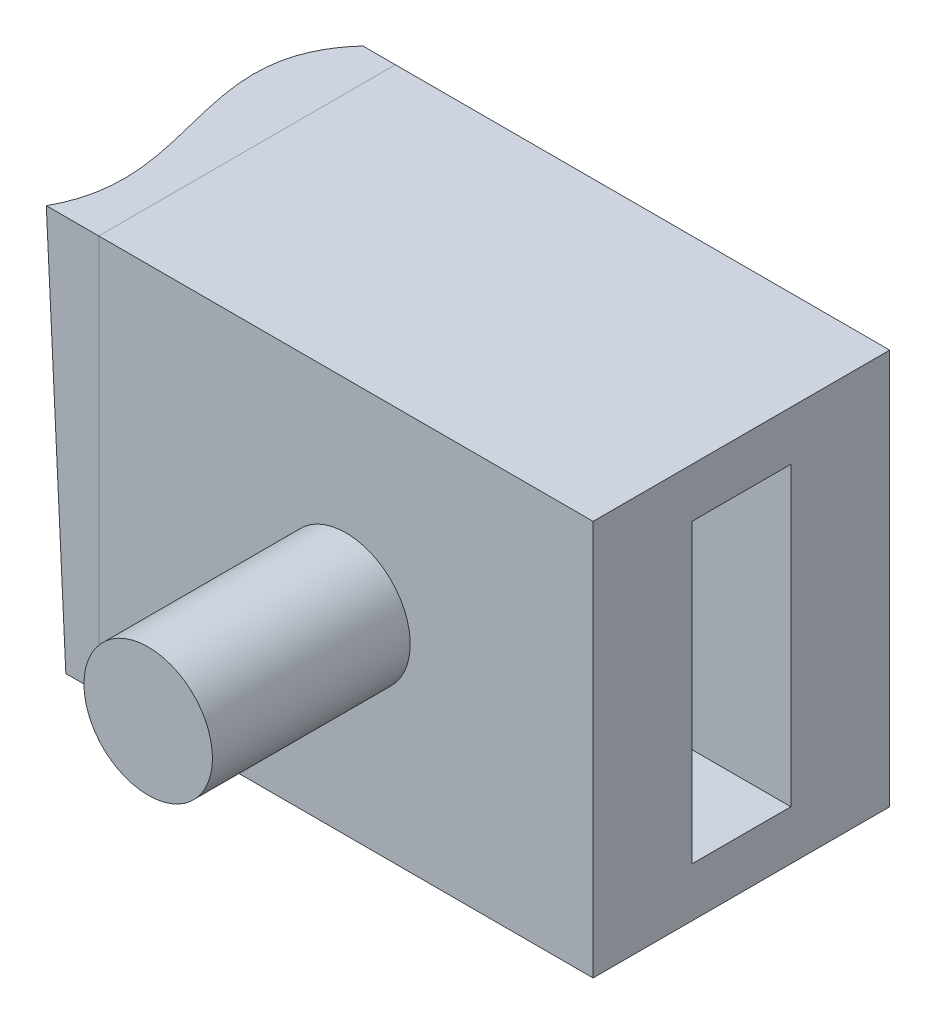
ISO-10303-21;
HEADER;
FILE_DESCRIPTION(('STEP AP214'),'2;1');
FILE_NAME('part.step','',(''),(''),'','','');
FILE_SCHEMA(('AUTOMOTIVE_DESIGN { 1 0 10303 214 1 1 1 1 }'));
ENDSEC;
DATA;
#1=APPLICATION_CONTEXT('core data for automotive mechanical design processes');
#2=APPLICATION_PROTOCOL_DEFINITION('international standard','automotive_design',2000,#1);
#3=PRODUCT_CONTEXT('',#1,'mechanical');
#4=PRODUCT('Part','Part','',(#3));
#5=PRODUCT_RELATED_PRODUCT_CATEGORY('part','',(#4));
#6=PRODUCT_DEFINITION_FORMATION('','',#4);
#7=PRODUCT_DEFINITION_CONTEXT('part definition',#1,'design');
#8=PRODUCT_DEFINITION('design','',#6,#7);
#9=PRODUCT_DEFINITION_SHAPE('','',#8);
#10=(LENGTH_UNIT() NAMED_UNIT(*) SI_UNIT(.MILLI.,.METRE.));
#11=(NAMED_UNIT(*) PLANE_ANGLE_UNIT() SI_UNIT($,.RADIAN.));
#12=(NAMED_UNIT(*) SI_UNIT($,.STERADIAN.) SOLID_ANGLE_UNIT());
#13=UNCERTAINTY_MEASURE_WITH_UNIT(LENGTH_MEASURE(1.E-05),#10,'distance_accuracy_value','');
#14=(GEOMETRIC_REPRESENTATION_CONTEXT(3) GLOBAL_UNCERTAINTY_ASSIGNED_CONTEXT((#13)) GLOBAL_UNIT_ASSIGNED_CONTEXT((#10,
#11,#12)) REPRESENTATION_CONTEXT('',''));
#15=CARTESIAN_POINT('',(0.,0.,0.));
#16=DIRECTION('',(0.,0.,1.));
#17=DIRECTION('',(1.,0.,0.));
#18=AXIS2_PLACEMENT_3D('',#15,#16,#17);
#19=CARTESIAN_POINT('',(12.5,0.,17.5));
#20=DIRECTION('',(0.,0.,1.));
#21=DIRECTION('',(1.,0.,0.));
#22=AXIS2_PLACEMENT_3D('',#19,#20,#21);
#23=PLANE('',#22);
#24=CARTESIAN_POINT('',(12.5,0.,17.5));
#25=DIRECTION('',(0.,0.,1.));
#26=DIRECTION('',(1.,0.,0.));
#27=AXIS2_PLACEMENT_3D('',#24,#25,#26);
#28=CIRCLE('',#27,3.25);
#29=CARTESIAN_POINT('',(15.75,0.,17.5));
#30=VERTEX_POINT('',#29);
#31=EDGE_CURVE('E324',#30,#30,#28,.T.);
#32=ORIENTED_EDGE('',*,*,#31,.T.);
#33=EDGE_LOOP('',(#32));
#34=FACE_BOUND('',#33,.T.);
#35=ADVANCED_FACE('F43',(#34),#23,.T.);
#36=CARTESIAN_POINT('',(12.5,0.,17.5));
#37=DIRECTION('',(0.,0.,-1.));
#38=DIRECTION('',(-1.,0.,0.));
#39=AXIS2_PLACEMENT_3D('',#36,#37,#38);
#40=CYLINDRICAL_SURFACE('',#39,3.25);
#41=ORIENTED_EDGE('',*,*,#31,.F.);
#42=EDGE_LOOP('',(#41));
#43=FACE_BOUND('',#42,.T.);
#44=CARTESIAN_POINT('',(12.5,0.,7.5));
#45=DIRECTION('',(0.,0.,-1.));
#46=DIRECTION('',(-1.,0.,0.));
#47=AXIS2_PLACEMENT_3D('',#44,#45,#46);
#48=CIRCLE('',#47,3.25);
#49=CARTESIAN_POINT('',(9.25,0.,7.5));
#50=VERTEX_POINT('',#49);
#51=EDGE_CURVE('E47',#50,#50,#48,.F.);
#52=ORIENTED_EDGE('',*,*,#51,.T.);
#53=EDGE_LOOP('',(#52));
#54=FACE_BOUND('',#53,.T.);
#55=ADVANCED_FACE('F377',(#43,#54),#40,.T.);
#56=CARTESIAN_POINT('',(25.,-7.5,2.5));
#57=DIRECTION('',(0.,1.,0.));
#58=DIRECTION('',(0.,0.,1.));
#59=AXIS2_PLACEMENT_3D('',#56,#57,#58);
#60=PLANE('',#59);
#61=DIRECTION('',(0.,0.,1.));
#62=VECTOR('',#61,1.);
#63=CARTESIAN_POINT('',(0.,-7.5,-2.5));
#64=LINE('',#63,#62);
#65=CARTESIAN_POINT('',(0.,-7.5,-2.5));
#66=VERTEX_POINT('',#65);
#67=CARTESIAN_POINT('',(0.,-7.5,2.5));
#68=VERTEX_POINT('',#67);
#69=EDGE_CURVE('E141',#66,#68,#64,.T.);
#70=ORIENTED_EDGE('',*,*,#69,.T.);
#71=DIRECTION('',(-1.,0.,0.));
#72=VECTOR('',#71,1.);
#73=CARTESIAN_POINT('',(25.,-7.5,2.5));
#74=LINE('',#73,#72);
#75=CARTESIAN_POINT('',(25.,-7.5,2.5));
#76=VERTEX_POINT('',#75);
#77=EDGE_CURVE('E133',#76,#68,#74,.T.);
#78=ORIENTED_EDGE('',*,*,#77,.F.);
#79=DIRECTION('',(0.,0.,-1.));
#80=VECTOR('',#79,1.);
#81=CARTESIAN_POINT('',(25.,-7.5,2.5));
#82=LINE('',#81,#80);
#83=CARTESIAN_POINT('',(25.,-7.5,-2.5));
#84=VERTEX_POINT('',#83);
#85=EDGE_CURVE('E138',#76,#84,#82,.T.);
#86=ORIENTED_EDGE('',*,*,#85,.T.);
#87=DIRECTION('',(-1.,0.,0.));
#88=VECTOR('',#87,1.);
#89=CARTESIAN_POINT('',(25.,-7.5,-2.5));
#90=LINE('',#89,#88);
#91=EDGE_CURVE('E145',#84,#66,#90,.T.);
#92=ORIENTED_EDGE('',*,*,#91,.T.);
#93=EDGE_LOOP('',(#70,#78,#86,#92));
#94=FACE_BOUND('',#93,.T.);
#95=ADVANCED_FACE('F135',(#94),#60,.T.);
#96=CARTESIAN_POINT('',(25.,7.5,2.5));
#97=DIRECTION('',(0.,0.,-1.));
#98=DIRECTION('',(-1.,0.,0.));
#99=AXIS2_PLACEMENT_3D('',#96,#97,#98);
#100=PLANE('',#99);
#101=DIRECTION('',(0.,1.,0.));
#102=VECTOR('',#101,1.);
#103=CARTESIAN_POINT('',(0.,-7.5,2.5));
#104=LINE('',#103,#102);
#105=CARTESIAN_POINT('',(0.,7.5,2.5));
#106=VERTEX_POINT('',#105);
#107=EDGE_CURVE('E322',#68,#106,#104,.T.);
#108=ORIENTED_EDGE('',*,*,#107,.T.);
#109=DIRECTION('',(-1.,0.,0.));
#110=VECTOR('',#109,1.);
#111=CARTESIAN_POINT('',(25.,7.5,2.5));
#112=LINE('',#111,#110);
#113=CARTESIAN_POINT('',(25.,7.5,2.5));
#114=VERTEX_POINT('',#113);
#115=EDGE_CURVE('E144',#114,#106,#112,.T.);
#116=ORIENTED_EDGE('',*,*,#115,.F.);
#117=DIRECTION('',(0.,-1.,0.));
#118=VECTOR('',#117,1.);
#119=CARTESIAN_POINT('',(25.,7.5,2.5));
#120=LINE('',#119,#118);
#121=EDGE_CURVE('E149',#114,#76,#120,.T.);
#122=ORIENTED_EDGE('',*,*,#121,.T.);
#123=ORIENTED_EDGE('',*,*,#77,.T.);
#124=EDGE_LOOP('',(#108,#116,#122,#123));
#125=FACE_BOUND('',#124,.T.);
#126=ADVANCED_FACE('F150',(#125),#100,.T.);
#127=CARTESIAN_POINT('',(25.,7.5,2.5));
#128=DIRECTION('',(0.,-1.,0.));
#129=DIRECTION('',(0.,0.,-1.));
#130=AXIS2_PLACEMENT_3D('',#127,#128,#129);
#131=PLANE('',#130);
#132=DIRECTION('',(0.,0.,-1.));
#133=VECTOR('',#132,1.);
#134=CARTESIAN_POINT('',(0.,7.5,2.5));
#135=LINE('',#134,#133);
#136=CARTESIAN_POINT('',(0.,7.5,-2.5));
#137=VERTEX_POINT('',#136);
#138=EDGE_CURVE('E332',#106,#137,#135,.T.);
#139=ORIENTED_EDGE('',*,*,#138,.T.);
#140=DIRECTION('',(-1.,0.,0.));
#141=VECTOR('',#140,1.);
#142=CARTESIAN_POINT('',(25.,7.5,-2.5));
#143=LINE('',#142,#141);
#144=CARTESIAN_POINT('',(25.,7.5,-2.5));
#145=VERTEX_POINT('',#144);
#146=EDGE_CURVE('E164',#145,#137,#143,.T.);
#147=ORIENTED_EDGE('',*,*,#146,.F.);
#148=DIRECTION('',(0.,0.,1.));
#149=VECTOR('',#148,1.);
#150=CARTESIAN_POINT('',(25.,7.5,2.5));
#151=LINE('',#150,#149);
#152=EDGE_CURVE('E154',#145,#114,#151,.T.);
#153=ORIENTED_EDGE('',*,*,#152,.T.);
#154=ORIENTED_EDGE('',*,*,#115,.T.);
#155=EDGE_LOOP('',(#139,#147,#153,#154));
#156=FACE_BOUND('',#155,.T.);
#157=ADVANCED_FACE('F329',(#156),#131,.T.);
#158=CARTESIAN_POINT('',(25.,7.5,-2.5));
#159=DIRECTION('',(0.,0.,1.));
#160=DIRECTION('',(1.,0.,0.));
#161=AXIS2_PLACEMENT_3D('',#158,#159,#160);
#162=PLANE('',#161);
#163=DIRECTION('',(0.,-1.,0.));
#164=VECTOR('',#163,1.);
#165=CARTESIAN_POINT('',(0.,7.5,-2.5));
#166=LINE('',#165,#164);
#167=EDGE_CURVE('E337',#137,#66,#166,.T.);
#168=ORIENTED_EDGE('',*,*,#167,.T.);
#169=ORIENTED_EDGE('',*,*,#91,.F.);
#170=DIRECTION('',(0.,1.,0.));
#171=VECTOR('',#170,1.);
#172=CARTESIAN_POINT('',(25.,7.5,-2.5));
#173=LINE('',#172,#171);
#174=EDGE_CURVE('E158',#84,#145,#173,.T.);
#175=ORIENTED_EDGE('',*,*,#174,.T.);
#176=ORIENTED_EDGE('',*,*,#146,.T.);
#177=EDGE_LOOP('',(#168,#169,#175,#176));
#178=FACE_BOUND('',#177,.T.);
#179=ADVANCED_FACE('F335',(#178),#162,.T.);
#180=CARTESIAN_POINT('',(25.,-10.,7.5));
#181=DIRECTION('',(0.,1.,0.));
#182=DIRECTION('',(0.,0.,1.));
#183=AXIS2_PLACEMENT_3D('',#180,#181,#182);
#184=PLANE('',#183);
#185=DIRECTION('',(0.,0.,1.));
#186=VECTOR('',#185,1.);
#187=CARTESIAN_POINT('',(0.,-10.,-7.5));
#188=LINE('',#187,#186);
#189=CARTESIAN_POINT('',(0.,-10.,-7.5));
#190=VERTEX_POINT('',#189);
#191=CARTESIAN_POINT('',(0.,-10.,7.5));
#192=VERTEX_POINT('',#191);
#193=EDGE_CURVE('E261',#190,#192,#188,.T.);
#194=ORIENTED_EDGE('',*,*,#193,.F.);
#195=DIRECTION('',(-1.,0.,0.));
#196=VECTOR('',#195,1.);
#197=CARTESIAN_POINT('',(25.,-10.,-7.5));
#198=LINE('',#197,#196);
#199=CARTESIAN_POINT('',(25.,-10.,-7.5));
#200=VERTEX_POINT('',#199);
#201=EDGE_CURVE('E174',#200,#190,#198,.T.);
#202=ORIENTED_EDGE('',*,*,#201,.F.);
#203=DIRECTION('',(0.,0.,-1.));
#204=VECTOR('',#203,1.);
#205=CARTESIAN_POINT('',(25.,-10.,7.5));
#206=LINE('',#205,#204);
#207=CARTESIAN_POINT('',(25.,-10.,7.5));
#208=VERTEX_POINT('',#207);
#209=EDGE_CURVE('E128',#208,#200,#206,.T.);
#210=ORIENTED_EDGE('',*,*,#209,.F.);
#211=DIRECTION('',(-1.,0.,0.));
#212=VECTOR('',#211,1.);
#213=CARTESIAN_POINT('',(25.,-10.,7.5));
#214=LINE('',#213,#212);
#215=EDGE_CURVE('E176',#208,#192,#214,.T.);
#216=ORIENTED_EDGE('',*,*,#215,.T.);
#217=EDGE_LOOP('',(#194,#202,#210,#216));
#218=FACE_BOUND('',#217,.T.);
#219=ADVANCED_FACE('F390',(#218),#184,.F.);
#220=CARTESIAN_POINT('',(25.,10.,7.5));
#221=DIRECTION('',(0.,-1.,0.));
#222=DIRECTION('',(0.,0.,-1.));
#223=AXIS2_PLACEMENT_3D('',#220,#221,#222);
#224=PLANE('',#223);
#225=DIRECTION('',(0.,0.,-1.));
#226=VECTOR('',#225,1.);
#227=CARTESIAN_POINT('',(0.,10.,7.5));
#228=LINE('',#227,#226);
#229=CARTESIAN_POINT('',(0.,10.,7.5));
#230=VERTEX_POINT('',#229);
#231=CARTESIAN_POINT('',(0.,10.,-7.5));
#232=VERTEX_POINT('',#231);
#233=EDGE_CURVE('E11',#230,#232,#228,.T.);
#234=ORIENTED_EDGE('',*,*,#233,.F.);
#235=DIRECTION('',(-1.,0.,0.));
#236=VECTOR('',#235,1.);
#237=CARTESIAN_POINT('',(25.,10.,7.5));
#238=LINE('',#237,#236);
#239=CARTESIAN_POINT('',(25.,10.,7.5));
#240=VERTEX_POINT('',#239);
#241=EDGE_CURVE('E179',#240,#230,#238,.T.);
#242=ORIENTED_EDGE('',*,*,#241,.F.);
#243=DIRECTION('',(0.,0.,1.));
#244=VECTOR('',#243,1.);
#245=CARTESIAN_POINT('',(25.,10.,7.5));
#246=LINE('',#245,#244);
#247=CARTESIAN_POINT('',(25.,10.,-7.5));
#248=VERTEX_POINT('',#247);
#249=EDGE_CURVE('E169',#248,#240,#246,.T.);
#250=ORIENTED_EDGE('',*,*,#249,.F.);
#251=DIRECTION('',(-1.,0.,0.));
#252=VECTOR('',#251,1.);
#253=CARTESIAN_POINT('',(25.,10.,-7.5));
#254=LINE('',#253,#252);
#255=EDGE_CURVE('E181',#248,#232,#254,.T.);
#256=ORIENTED_EDGE('',*,*,#255,.T.);
#257=EDGE_LOOP('',(#234,#242,#250,#256));
#258=FACE_BOUND('',#257,.T.);
#259=ADVANCED_FACE('F395',(#258),#224,.F.);
#260=CARTESIAN_POINT('',(25.,10.,-7.5));
#261=DIRECTION('',(0.,0.,1.));
#262=DIRECTION('',(1.,0.,0.));
#263=AXIS2_PLACEMENT_3D('',#260,#261,#262);
#264=PLANE('',#263);
#265=DIRECTION('',(0.,-1.,0.));
#266=VECTOR('',#265,1.);
#267=CARTESIAN_POINT('',(0.,10.,-7.5));
#268=LINE('',#267,#266);
#269=EDGE_CURVE('E63',#232,#190,#268,.T.);
#270=ORIENTED_EDGE('',*,*,#269,.F.);
#271=ORIENTED_EDGE('',*,*,#255,.F.);
#272=DIRECTION('',(0.,1.,0.));
#273=VECTOR('',#272,1.);
#274=CARTESIAN_POINT('',(25.,10.,-7.5));
#275=LINE('',#274,#273);
#276=EDGE_CURVE('E167',#200,#248,#275,.T.);
#277=ORIENTED_EDGE('',*,*,#276,.F.);
#278=ORIENTED_EDGE('',*,*,#201,.T.);
#279=EDGE_LOOP('',(#270,#271,#277,#278));
#280=FACE_BOUND('',#279,.T.);
#281=ADVANCED_FACE('F45',(#280),#264,.F.);
#282=CARTESIAN_POINT('',(25.,0.,0.));
#283=DIRECTION('',(1.,0.,0.));
#284=DIRECTION('',(0.,0.,-1.));
#285=AXIS2_PLACEMENT_3D('',#282,#283,#284);
#286=PLANE('',#285);
#287=ORIENTED_EDGE('',*,*,#276,.T.);
#288=ORIENTED_EDGE('',*,*,#249,.T.);
#289=DIRECTION('',(0.,-1.,0.));
#290=VECTOR('',#289,1.);
#291=CARTESIAN_POINT('',(25.,10.,7.5));
#292=LINE('',#291,#290);
#293=EDGE_CURVE('E171',#240,#208,#292,.T.);
#294=ORIENTED_EDGE('',*,*,#293,.T.);
#295=ORIENTED_EDGE('',*,*,#209,.T.);
#296=EDGE_LOOP('',(#287,#288,#294,#295));
#297=FACE_BOUND('',#296,.T.);
#298=ORIENTED_EDGE('',*,*,#152,.F.);
#299=ORIENTED_EDGE('',*,*,#174,.F.);
#300=ORIENTED_EDGE('',*,*,#85,.F.);
#301=ORIENTED_EDGE('',*,*,#121,.F.);
#302=EDGE_LOOP('',(#298,#299,#300,#301));
#303=FACE_BOUND('',#302,.T.);
#304=ADVANCED_FACE('F157',(#297,#303),#286,.T.);
#305=CARTESIAN_POINT('',(25.,10.,7.5));
#306=DIRECTION('',(0.,0.,-1.));
#307=DIRECTION('',(-1.,0.,0.));
#308=AXIS2_PLACEMENT_3D('',#305,#306,#307);
#309=PLANE('',#308);
#310=DIRECTION('',(0.,1.,0.));
#311=VECTOR('',#310,1.);
#312=CARTESIAN_POINT('',(0.,-10.,7.5));
#313=LINE('',#312,#311);
#314=EDGE_CURVE('E312',#192,#230,#313,.T.);
#315=ORIENTED_EDGE('',*,*,#314,.F.);
#316=ORIENTED_EDGE('',*,*,#215,.F.);
#317=ORIENTED_EDGE('',*,*,#293,.F.);
#318=ORIENTED_EDGE('',*,*,#241,.T.);
#319=EDGE_LOOP('',(#315,#316,#317,#318));
#320=FACE_BOUND('',#319,.T.);
#321=ORIENTED_EDGE('',*,*,#51,.F.);
#322=EDGE_LOOP('',(#321));
#323=FACE_BOUND('',#322,.T.);
#324=ADVANCED_FACE('F219',(#320,#323),#309,.F.);
#325=CARTESIAN_POINT('',(3.71805831252915,13.079715564425,-10.2531807446201));
#326=CARTESIAN_POINT('',(-6.04701305923015,-13.0797172798257,-10.613541833322));
#327=CARTESIAN_POINT('',(-2.77246559441149,13.079715564425,-8.0014481940857));
#328=CARTESIAN_POINT('',(-0.96262990089649,-13.0797172798257,-7.8917788356021));
#329=CARTESIAN_POINT('',(-4.88527352275378,13.079715564425,-1.33938259411544));
#330=CARTESIAN_POINT('',(-3.86404941263161,-13.0797172798257,-0.734794599162323));
#331=CARTESIAN_POINT('',(0.673781907109332,13.0797155644249,6.29134710421849));
#332=CARTESIAN_POINT('',(-0.111870438855858,-13.0797172798256,6.10317211042511));
#333=CARTESIAN_POINT('',(-5.96230706943497,13.079715564425,10.4735000024621));
#334=CARTESIAN_POINT('',(-2.51721163450627,-13.0797172798257,10.5545776532944));
#335=B_SPLINE_SURFACE_WITH_KNOTS('',3,1,((#325,#326),(#327,#328),(#329,#330),(#331,#332),(#333,
#334)),.UNSPECIFIED.,.F.,.F.,.F.,(4,1,4),(2,2),(-0.211521540195221,0.336660749383848,
1.19995337271277),(-0.153985778221248,1.15398586399128),.UNSPECIFIED.);
#336=CARTESIAN_POINT('',(-3.02294094052801,7.499999998,-2.5));
#337=CARTESIAN_POINT('',(-2.90743784606255,4.46176789050985,-2.5));
#338=CARTESIAN_POINT('',(-2.78972095341892,1.42362288899021,-2.5));
#339=CARTESIAN_POINT('',(-2.5923424358101,-3.57632632938115,-2.5));
#340=CARTESIAN_POINT('',(-2.51397140895736,-5.53818132719484,-2.5));
#341=CARTESIAN_POINT('',(-2.43467718203889,-7.5,-2.5));
#342=B_SPLINE_CURVE_WITH_KNOTS('',3,(#336,#337,#338,#339,#340,#341),.UNSPECIFIED.,.F.,.F.,(4,2,
4),(0.,9.12127408061243,15.0115332814175),.UNSPECIFIED.);
#343=CARTESIAN_POINT('',(-3.02294094056566,7.499999999,-2.4999999999963));
#344=VERTEX_POINT('',#343);
#345=CARTESIAN_POINT('',(-2.43467718203889,-7.5,-2.5));
#346=VERTEX_POINT('',#345);
#347=EDGE_CURVE('E186',#344,#346,#342,.T.);
#348=CARTESIAN_POINT('',(-2.01556673417182,7.5,2.49999999846474));
#349=CARTESIAN_POINT('',(-2.05230035302554,7.5,2.29047338988391));
#350=CARTESIAN_POINT('',(-2.09284809192719,7.5,2.08168809548985));
#351=CARTESIAN_POINT('',(-2.17916728765718,7.5,1.66530011040875));
#352=CARTESIAN_POINT('',(-2.22493608722889,7.5,1.45769687410312));
#353=CARTESIAN_POINT('',(-2.31933124886649,7.5,1.04317766249757));
#354=CARTESIAN_POINT('',(-2.36795738739771,7.5,0.836261634770593));
#355=CARTESIAN_POINT('',(-2.46579715598391,7.5,0.422594229911286));
#356=CARTESIAN_POINT('',(-2.51501071726817,7.5,0.215842836470098));
#357=CARTESIAN_POINT('',(-2.61178107212261,7.5,-0.198225064236752));
#358=CARTESIAN_POINT('',(-2.65933654163239,7.5,-0.405541886760893));
#359=CARTESIAN_POINT('',(-2.75032763324649,7.5,-0.820983372087367));
#360=CARTESIAN_POINT('',(-2.79376525823959,7.5,-1.02910759036761));
#361=CARTESIAN_POINT('',(-2.87397285628504,7.5,-1.44667362325109));
#362=CARTESIAN_POINT('',(-2.91074317664168,7.5,-1.65611536863508));
#363=CARTESIAN_POINT('',(-2.97475649540934,7.5,-2.07677853778099));
#364=CARTESIAN_POINT('',(-3.00198379047713,7.5,-2.2880023145938));
#365=CARTESIAN_POINT('',(-3.02294094060331,7.5,-2.49999999999258));
#366=B_SPLINE_CURVE_WITH_KNOTS('',3,(#348,#349,#350,#351,#352,#353,#354,#355,#356,#357,#358,
#359,#360,#361,#362,#363,#364,#365),.UNSPECIFIED.,.F.,.F.,(4,2,2,2,2,2,2,2,4),(0.,
0.638031665467256,1.27574004170358,1.91339859513445,2.55098321490764,3.18906582741853,
3.82683647158981,4.46457388431807,5.10335584043032),.UNSPECIFIED.);
#367=CARTESIAN_POINT('',(-2.01556673403733,7.50000000000172,2.49999999923237));
#368=VERTEX_POINT('',#367);
#369=EDGE_CURVE('E232',#368,#344,#366,.T.);
#370=CARTESIAN_POINT('',(-1.82190643616031,-7.499999998,2.5));
#371=CARTESIAN_POINT('',(-1.85440893982273,-5.00000292426067,2.5));
#372=CARTESIAN_POINT('',(-1.88679854972957,-2.50000439298545,2.5));
#373=CARTESIAN_POINT('',(-1.95135198231237,2.49999560634901,2.5));
#374=CARTESIAN_POINT('',(-1.98351580498639,4.99999707440827,2.5));
#375=CARTESIAN_POINT('',(-2.01556673390285,7.50000000000345,2.5));
#376=B_SPLINE_CURVE_WITH_KNOTS('',3,(#370,#371,#372,#373,#374,#375),.UNSPECIFIED.,.F.,.F.,(4,2,
4),(0.,7.50062501988158,15.0012501049053),.UNSPECIFIED.);
#377=CARTESIAN_POINT('',(-1.82190643614764,-7.499999999,2.49999999999795));
#378=VERTEX_POINT('',#377);
#379=EDGE_CURVE('E195',#378,#368,#376,.T.);
#380=CARTESIAN_POINT('',(-2.43467718203889,-7.5,-2.5));
#381=CARTESIAN_POINT('',(-2.43710635759252,-7.5,-2.33123989885821));
#382=CARTESIAN_POINT('',(-2.4355142225485,-7.5,-2.1624705124723));
#383=CARTESIAN_POINT('',(-2.42535164054188,-7.5,-1.82560766978626));
#384=CARTESIAN_POINT('',(-2.41680073975261,-7.5,-1.65751364381893));
#385=CARTESIAN_POINT('',(-2.39379991596281,-7.5,-1.32194087490679));
#386=CARTESIAN_POINT('',(-2.37935675491646,-7.5,-1.15446164798));
#387=CARTESIAN_POINT('',(-2.34562229639967,-7.5,-0.820024923655081));
#388=CARTESIAN_POINT('',(-2.32633169392173,-7.5,-0.653067354936386));
#389=CARTESIAN_POINT('',(-2.28391910511438,-7.5,-0.319592014422724));
#390=CARTESIAN_POINT('',(-2.26079586208074,-7.5,-0.153074405143188));
#391=CARTESIAN_POINT('',(-2.21176054311499,-7.5,0.179266437505834));
#392=CARTESIAN_POINT('',(-2.18585308030493,-7.5,0.345090360598223));
#393=CARTESIAN_POINT('',(-2.13216504886193,-7.5,0.676547538599664));
#394=CARTESIAN_POINT('',(-2.10438321071005,-7.5,0.842180585411005));
#395=CARTESIAN_POINT('',(-2.04788581814281,-7.5,1.17341513711095));
#396=CARTESIAN_POINT('',(-2.0191695690994,-7.5,1.33901652202397));
#397=CARTESIAN_POINT('',(-1.96173590289252,-7.5,1.67034677580706));
#398=CARTESIAN_POINT('',(-1.93301850075337,-7.5,1.83607564786485));
#399=CARTESIAN_POINT('',(-1.87651968521027,-7.5,2.16781622388676));
#400=CARTESIAN_POINT('',(-1.84873896922882,-7.5,2.33382804595284));
#401=CARTESIAN_POINT('',(-1.82190643613496,-7.5,2.4999999999959));
#402=B_SPLINE_CURVE_WITH_KNOTS('',3,(#380,#381,#382,#383,#384,#385,#386,#387,#388,#389,#390,
#391,#392,#393,#394,#395,#396,#397,#398,#399,#400,#401),.UNSPECIFIED.,.F.,.F.,(4,2,2,2,2,2,2,2,
2,2,4),(0.,0.506214828560079,1.01101266003552,1.51523280816847,2.01938070592317,
2.52369423954171,3.02718470534394,3.5310196779469,4.03523815884225,4.53983175291547,
5.04479310546718),.UNSPECIFIED.);
#403=EDGE_CURVE('E189',#346,#378,#402,.T.);
#404=CARTESIAN_POINT('',(-2.65382747164623,10.,7.5));
#405=CARTESIAN_POINT('',(-2.58976873908117,10.,7.38542182288859));
#406=CARTESIAN_POINT('',(-2.52928199258317,10.,7.26882968297453));
#407=CARTESIAN_POINT('',(-2.41591457758694,10.,7.03210546056742));
#408=CARTESIAN_POINT('',(-2.36302870473045,10.,6.91197586874681));
#409=CARTESIAN_POINT('',(-2.26525291061821,10.,6.66854845128063));
#410=CARTESIAN_POINT('',(-2.22036020391473,10.,6.54525174651265));
#411=CARTESIAN_POINT('',(-2.1396133661977,10.,6.29855654701082));
#412=CARTESIAN_POINT('',(-2.10359155466888,10.,6.17521285891896));
#413=CARTESIAN_POINT('',(-2.0394417759481,10.,5.92648503544024));
#414=CARTESIAN_POINT('',(-2.01131424579461,10.,5.80110078749151));
#415=CARTESIAN_POINT('',(-1.9628080274383,10.,5.54885770354723));
#416=CARTESIAN_POINT('',(-1.94242900608566,10.,5.42199893119111));
#417=CARTESIAN_POINT('',(-1.90573223701218,10.,5.14153922261125));
#418=CARTESIAN_POINT('',(-1.8910706867077,10.,4.98772124633624));
#419=CARTESIAN_POINT('',(-1.87168598300949,10.,4.67942315313342));
#420=CARTESIAN_POINT('',(-1.86696684706436,10.,4.5249427938094));
#421=CARTESIAN_POINT('',(-1.86647181649495,10.,4.21597039860685));
#422=CARTESIAN_POINT('',(-1.87069709918418,10.,4.06147836386805));
#423=CARTESIAN_POINT('',(-1.90341648895855,10.,3.44161198355216));
#424=CARTESIAN_POINT('',(-1.96367643994806,9.99999999999999,2.977935429899));
#425=CARTESIAN_POINT('',(-2.10343929294784,9.99999999999999,2.1819036279919));
#426=CARTESIAN_POINT('',(-2.17349251793266,10.,1.84757670042943));
#427=CARTESIAN_POINT('',(-2.325069074671,10.,1.18134519499351));
#428=CARTESIAN_POINT('',(-2.40659810118094,10.,0.849441906368671));
#429=CARTESIAN_POINT('',(-2.57139084204593,10.,0.186162493406757));
#430=CARTESIAN_POINT('',(-2.65465438939259,10.,-0.145213678406971));
#431=CARTESIAN_POINT('',(-2.81314613807856,10.,-0.809842679752115));
#432=CARTESIAN_POINT('',(-2.88837821838371,10.,-1.1430945207673));
#433=CARTESIAN_POINT('',(-2.99495273054269,10.,-1.68664577849802));
#434=CARTESIAN_POINT('',(-3.0321326493646,10.,-1.89577171127911));
#435=CARTESIAN_POINT('',(-3.09607041411064,10.,-2.31571206073369));
#436=CARTESIAN_POINT('',(-3.12282604069634,10.,-2.52652682722164));
#437=CARTESIAN_POINT('',(-3.16245964138483,10.,-2.94876375894344));
#438=CARTESIAN_POINT('',(-3.1753865793122,10.,-3.16018110568352));
#439=CARTESIAN_POINT('',(-3.18395883278383,10.,-3.58340088435166));
#440=CARTESIAN_POINT('',(-3.17961281987544,10.,-3.79520306970864));
#441=CARTESIAN_POINT('',(-3.15774319987253,10.,-4.11042300695011));
#442=CARTESIAN_POINT('',(-3.14800807098339,10.,-4.21440675549799));
#443=CARTESIAN_POINT('',(-3.12319033948499,10.,-4.42174536385941));
#444=CARTESIAN_POINT('',(-3.10810777470012,10.,-4.52510022811602));
#445=CARTESIAN_POINT('',(-3.07232587908241,10.,-4.7308350149521));
#446=CARTESIAN_POINT('',(-3.05162663775079,10.,-4.83321495304002));
#447=CARTESIAN_POINT('',(-3.00441212049022,10.,-5.03673750402579));
#448=CARTESIAN_POINT('',(-2.97789103304569,10.,-5.13787877317702));
#449=CARTESIAN_POINT('',(-2.91897395807167,10.,-5.3384434046531));
#450=CARTESIAN_POINT('',(-2.88657768190693,10.,-5.43786668231381));
#451=CARTESIAN_POINT('',(-2.81596366051854,10.,-5.63460229719512));
#452=CARTESIAN_POINT('',(-2.77774702005288,10.,-5.73191503102011));
#453=CARTESIAN_POINT('',(-2.69295240431694,10.,-5.93041251259724));
#454=CARTESIAN_POINT('',(-2.64599076848844,10.,-6.03143350806893));
#455=CARTESIAN_POINT('',(-2.54592281347086,10.,-6.2304137361719));
#456=CARTESIAN_POINT('',(-2.49281482733082,10.,-6.32837212900267));
#457=CARTESIAN_POINT('',(-2.38083958360236,10.,-6.52099860701866));
#458=CARTESIAN_POINT('',(-2.32196948117418,10.,-6.61566503533638));
#459=CARTESIAN_POINT('',(-2.19865578689584,10.,-6.80195312380327));
#460=CARTESIAN_POINT('',(-2.1341864298134,10.,-6.89355769601461));
#461=CARTESIAN_POINT('',(-2.00045084112678,10.,-7.07312202396845));
#462=CARTESIAN_POINT('',(-1.93118668806756,10.,-7.16108333296077));
#463=CARTESIAN_POINT('',(-1.78844257041277,10.,-7.3332850329973));
#464=CARTESIAN_POINT('',(-1.71496946318037,10.,-7.41753110172263));
#465=CARTESIAN_POINT('',(-1.63958376296854,9.99999999999999,-7.49999999996419));
#466=B_SPLINE_CURVE_WITH_KNOTS('',3,(#404,#405,#406,#407,#408,#409,#410,#411,#412,#413,#414,
#415,#416,#417,#418,#419,#420,#421,#422,#423,#424,#425,#426,#427,#428,#429,#430,#431,#432,#433,
#434,#435,#436,#437,#438,#439,#440,#441,#442,#443,#444,#445,#446,#447,#448,#449,#450,#451,#452,
#453,#454,#455,#456,#457,#458,#459,#460,#461,#462,#463,#464,#465),.UNSPECIFIED.,.F.,.F.,(4,2,2,
2,2,2,2,2,2,2,2,2,2,2,2,2,2,2,2,2,2,2,2,2,2,2,2,2,2,2,4),(0.,0.393767040178918,
0.787263168235015,1.18062190176344,1.56584807476138,1.95109557021522,2.33632649994675,
2.79950793869618,3.26287650010545,3.72630605642243,5.1248129295651,6.14948517725025,
7.17466771321904,8.19975199157213,9.2243389225138,9.86136888998857,10.4985344075335,
11.1334363421151,11.7680195768619,12.0812192219957,12.394416651796,12.7076090911171,
13.0211156004346,13.3346375158202,13.6480999958947,13.9820897909393,14.3161703805301,
14.6504167505821,14.9862921408838,15.3220228300716,15.6572212881139),.UNSPECIFIED.);
#467=CARTESIAN_POINT('',(-2.65382747164623,10.,7.5));
#468=VERTEX_POINT('',#467);
#469=CARTESIAN_POINT('',(-1.63958376298812,9.999999999,-7.4999999999821));
#470=VERTEX_POINT('',#469);
#471=EDGE_CURVE('E54',#468,#470,#466,.T.);
#472=CARTESIAN_POINT('',(-1.63958376300771,9.999999998,-7.5));
#473=CARTESIAN_POINT('',(-1.69420102399825,8.48076578127648,-7.49999999999999));
#474=CARTESIAN_POINT('',(-1.74994830275751,6.96157236769615,-7.5));
#475=CARTESIAN_POINT('',(-1.86360234395219,3.92326933620503,-7.5));
#476=CARTESIAN_POINT('',(-1.92150910207278,2.40415971813287,-7.50000000000001));
#477=CARTESIAN_POINT('',(-2.05083571548456,-0.929202283553895,-7.50000000000001));
#478=CARTESIAN_POINT('',(-2.12269464201461,-2.7434376271144,-7.5));
#479=CARTESIAN_POINT('',(-2.2691936797476,-6.37180039708766,-7.5));
#480=CARTESIAN_POINT('',(-2.34383379758684,-8.18592782323256,-7.49999999999999));
#481=CARTESIAN_POINT('',(-2.41978628470904,-9.99999999997924,-7.5));
#482=B_SPLINE_CURVE_WITH_KNOTS('',3,(#472,#473,#474,#475,#476,#477,#478,#479,#480,#481),
.UNSPECIFIED.,.F.,.F.,(4,2,2,2,4),(0.,4.56064628564122,9.12128345916451,14.5682549216725,
20.0152393822424),.UNSPECIFIED.);
#483=CARTESIAN_POINT('',(-2.41978628446113,-9.99999999998962,-7.49999999925613));
#484=VERTEX_POINT('',#483);
#485=EDGE_CURVE('E255',#470,#484,#482,.T.);
#486=CARTESIAN_POINT('',(-2.41978628421321,-10.,-7.49999999851226));
#487=CARTESIAN_POINT('',(-2.3948217406587,-10.,-7.42525427263119));
#488=CARTESIAN_POINT('',(-2.37165337917653,-10.,-7.3499153082037));
#489=CARTESIAN_POINT('',(-2.32898011668749,-10.,-7.19876332245786));
#490=CARTESIAN_POINT('',(-2.30945119824792,-10.,-7.12295708795456));
#491=CARTESIAN_POINT('',(-2.27386980249473,-10.,-6.97090286588149));
#492=CARTESIAN_POINT('',(-2.25780178514021,-10.,-6.89465850119323));
#493=CARTESIAN_POINT('',(-2.22893016907704,-10.,-6.74176130184065));
#494=CARTESIAN_POINT('',(-2.21611821956865,-10.,-6.66511003751336));
#495=CARTESIAN_POINT('',(-2.19354087724985,-10.,-6.51143358597449));
#496=CARTESIAN_POINT('',(-2.18377274870059,-10.,-6.43440879809488));
#497=CARTESIAN_POINT('',(-2.16704322872873,-10.,-6.27991329125176));
#498=CARTESIAN_POINT('',(-2.16008707806818,-10.,-6.20244201009357));
#499=CARTESIAN_POINT('',(-2.14876571989659,-10.,-6.04722885540438));
#500=CARTESIAN_POINT('',(-2.14440332650455,-10.,-5.9694867796883));
#501=CARTESIAN_POINT('',(-2.13802185795549,-10.,-5.81379587217904));
#502=CARTESIAN_POINT('',(-2.13600620043501,-10.,-5.73584690412839));
#503=CARTESIAN_POINT('',(-2.13406080292339,-10.,-5.57980634887349));
#504=CARTESIAN_POINT('',(-2.13413425500814,-10.,-5.5017147257452));
#505=CARTESIAN_POINT('',(-2.13610221414168,-10.,-5.34545250134947));
#506=CARTESIAN_POINT('',(-2.13799913767008,-9.99999999999999,-5.26728193279672));
#507=CARTESIAN_POINT('',(-2.14897548844279,-9.99999999999998,-4.94601984933304));
#508=CARTESIAN_POINT('',(-2.16476368562576,-9.99999999999999,-4.70317236165616));
#509=CARTESIAN_POINT('',(-2.20307516893525,-10.,-4.2178366487867));
#510=CARTESIAN_POINT('',(-2.22560623178066,-10.,-3.97534916508508));
#511=CARTESIAN_POINT('',(-2.25839747391685,-10.,-3.61168221444101));
#512=CARTESIAN_POINT('',(-2.26915330490194,-10.,-3.49055356145706));
#513=CARTESIAN_POINT('',(-2.28933229330061,-10.,-3.24818045503));
#514=CARTESIAN_POINT('',(-2.29875542323337,-10.,-3.12693599925088));
#515=CARTESIAN_POINT('',(-2.31521894239617,-10.,-2.88467141286189));
#516=CARTESIAN_POINT('',(-2.32226696169487,-10.,-2.76365183037015));
#517=CARTESIAN_POINT('',(-2.33032072455858,-10.,-2.58201343026892));
#518=CARTESIAN_POINT('',(-2.33258557486097,-10.,-2.52145071109252));
#519=CARTESIAN_POINT('',(-2.33613024954663,-10.,-2.40029665515601));
#520=CARTESIAN_POINT('',(-2.33741007893154,-10.,-2.33970531854278));
#521=CARTESIAN_POINT('',(-2.33977965658737,-10.,-2.1581707396939));
#522=CARTESIAN_POINT('',(-2.33941130520376,-10.,-2.03720624246735));
#523=CARTESIAN_POINT('',(-2.33514755611079,-10.,-1.79533470749491));
#524=CARTESIAN_POINT('',(-2.33125184144972,-10.,-1.6744276758894));
#525=CARTESIAN_POINT('',(-2.32028521664399,-10.,-1.43281475981187));
#526=CARTESIAN_POINT('',(-2.31321574561839,-10.,-1.31210880903267));
#527=CARTESIAN_POINT('',(-2.29626521648595,-10.,-1.07090196027366));
#528=CARTESIAN_POINT('',(-2.28638424566577,-10.,-0.950401056044718));
#529=CARTESIAN_POINT('',(-2.25316072288626,-10.,-0.590261903192694));
#530=CARTESIAN_POINT('',(-2.22618464046982,-10.,-0.350958490548149));
#531=CARTESIAN_POINT('',(-2.16522389139692,-10.,0.127646731299499));
#532=CARTESIAN_POINT('',(-2.13121280840398,-10.,0.366945032354662));
#533=CARTESIAN_POINT('',(-2.05888764377339,-10.,0.845687563717758));
#534=CARTESIAN_POINT('',(-2.02055968519011,-10.,1.0851296529297));
#535=CARTESIAN_POINT('',(-1.94231562846981,-10.,1.56429117727089));
#536=CARTESIAN_POINT('',(-1.90239620861293,-10.,1.80401005635487));
#537=CARTESIAN_POINT('',(-1.8237036238863,-10.,2.28386144468669));
#538=CARTESIAN_POINT('',(-1.78493152632304,-9.99999999999999,2.52399413197857));
#539=CARTESIAN_POINT('',(-1.71129354335896,-10.,3.00482097095444));
#540=CARTESIAN_POINT('',(-1.67642675379029,-10.,3.24551497945146));
#541=CARTESIAN_POINT('',(-1.62744928173538,-10.,3.62010226688842));
#542=CARTESIAN_POINT('',(-1.61102272646374,-10.,3.75369044487123));
#543=CARTESIAN_POINT('',(-1.58070747406518,-10.,4.02106096243054));
#544=CARTESIAN_POINT('',(-1.56681697242673,-10.,4.15484309514204));
#545=CARTESIAN_POINT('',(-1.54205842257305,-10.,4.42255076494956));
#546=CARTESIAN_POINT('',(-1.53118726256269,-10.,4.5564760105309));
#547=CARTESIAN_POINT('',(-1.5129463565941,-10.,4.82441876866839));
#548=CARTESIAN_POINT('',(-1.50557271650372,-10.,4.95843601144608));
#549=CARTESIAN_POINT('',(-1.49479709639494,-10.,5.22651073895713));
#550=CARTESIAN_POINT('',(-1.49139145373743,-10.,5.36056807215017));
#551=CARTESIAN_POINT('',(-1.48901045601231,-10.,5.6286615385733));
#552=CARTESIAN_POINT('',(-1.49003293514314,-10.,5.76269765010915));
#553=CARTESIAN_POINT('',(-1.4969514215106,-10.,6.03068446005971));
#554=CARTESIAN_POINT('',(-1.50284870177358,-10.,6.16463512701568));
#555=CARTESIAN_POINT('',(-1.51993905260468,-10.,6.43238398338472));
#556=CARTESIAN_POINT('',(-1.53113923410843,-10.,6.56618172551524));
#557=CARTESIAN_POINT('',(-1.55924135433252,-10.,6.83356161297277));
#558=CARTESIAN_POINT('',(-1.57615912630963,-10.,6.96714211314984));
#559=CARTESIAN_POINT('',(-1.61605499574265,-10.,7.23401948905687));
#560=CARTESIAN_POINT('',(-1.6390605502573,-10.,7.36731224953512));
#561=CARTESIAN_POINT('',(-1.66521732508733,-10.,7.50000000001875));
#562=B_SPLINE_CURVE_WITH_KNOTS('',3,(#486,#487,#488,#489,#490,#491,#492,#493,#494,#495,#496,
#497,#498,#499,#500,#501,#502,#503,#504,#505,#506,#507,#508,#509,#510,#511,#512,#513,#514,#515,
#516,#517,#518,#519,#520,#521,#522,#523,#524,#525,#526,#527,#528,#529,#530,#531,#532,#533,#534,
#535,#536,#537,#538,#539,#540,#541,#542,#543,#544,#545,#546,#547,#548,#549,#550,#551,#552,#553,
#554,#555,#556,#557,#558,#559,#560,#561),.UNSPECIFIED.,.F.,.F.,(4,2,2,2,2,2,2,2,2,2,2,2,2,2,2,2,
2,2,2,2,2,2,2,2,2,2,2,2,2,2,2,2,2,2,2,2,2,4),(0.,0.236381686128476,0.471143462132245,
0.704828065117299,0.937907150148661,1.17077613903208,1.40407715332,1.63763082981024,
1.8715242152015,2.105774999502,2.34033664347335,3.07011331309455,3.80073491781722,
4.16554626837693,4.53036514039354,4.8940005993134,5.0758088197874,5.25761611708644,
5.62044823485107,5.98331295818195,6.34601330880756,6.70870240015947,7.43099293641828,
8.15604657150936,8.8835013163513,9.61256328959549,10.3422834188572,11.0718342505166,
11.4755979527156,11.8790732303343,12.2821311218691,12.684739189944,13.0869753376116,
13.4890147731501,13.8911592321615,14.2938444814818,14.6976541179214,15.1033170074104),.UNSPECIFIED.);
#563=CARTESIAN_POINT('',(-1.66521732508548,-10.,7.50000000000938));
#564=VERTEX_POINT('',#563);
#565=EDGE_CURVE('E262',#484,#564,#562,.T.);
#566=DIRECTION('',(-0.0493702291330705,0.998780546704504,0.));
#567=VECTOR('',#566,1.);
#568=CARTESIAN_POINT('',(-1.66521732508364,-10.,7.5));
#569=LINE('',#568,#567);
#570=EDGE_CURVE('E318',#564,#468,#569,.T.);
#571=ORIENTED_EDGE('',*,*,#347,.F.);
#572=ORIENTED_EDGE('',*,*,#369,.F.);
#573=ORIENTED_EDGE('',*,*,#379,.F.);
#574=ORIENTED_EDGE('',*,*,#403,.F.);
#575=EDGE_LOOP('',(#571,#572,#573,#574));
#576=FACE_BOUND('',#575,.T.);
#577=ORIENTED_EDGE('',*,*,#471,.T.);
#578=ORIENTED_EDGE('',*,*,#485,.T.);
#579=ORIENTED_EDGE('',*,*,#565,.T.);
#580=ORIENTED_EDGE('',*,*,#570,.T.);
#581=EDGE_LOOP('',(#577,#578,#579,#580));
#582=FACE_BOUND('',#581,.T.);
#583=ADVANCED_FACE('F213',(#576,#582),#335,.F.);
#584=CARTESIAN_POINT('',(0.,7.5,-2.5));
#585=DIRECTION('',(0.,0.,-1.));
#586=DIRECTION('',(-1.,0.,0.));
#587=AXIS2_PLACEMENT_3D('',#584,#585,#586);
#588=PLANE('',#587);
#589=ORIENTED_EDGE('',*,*,#347,.T.);
#590=DIRECTION('',(-1.,0.,0.));
#591=VECTOR('',#590,1.);
#592=CARTESIAN_POINT('',(0.,-7.5,-2.5));
#593=LINE('',#592,#591);
#594=EDGE_CURVE('E345',#66,#346,#593,.T.);
#595=ORIENTED_EDGE('',*,*,#594,.F.);
#596=ORIENTED_EDGE('',*,*,#167,.F.);
#597=DIRECTION('',(-1.,0.,0.));
#598=VECTOR('',#597,1.);
#599=CARTESIAN_POINT('',(0.,7.5,-2.5));
#600=LINE('',#599,#598);
#601=EDGE_CURVE('E340',#137,#344,#600,.T.);
#602=ORIENTED_EDGE('',*,*,#601,.T.);
#603=EDGE_LOOP('',(#589,#595,#596,#602));
#604=FACE_BOUND('',#603,.T.);
#605=ADVANCED_FACE('F210',(#604),#588,.F.);
#606=CARTESIAN_POINT('',(0.,7.5,2.5));
#607=DIRECTION('',(0.,1.,0.));
#608=DIRECTION('',(0.,0.,1.));
#609=AXIS2_PLACEMENT_3D('',#606,#607,#608);
#610=PLANE('',#609);
#611=ORIENTED_EDGE('',*,*,#369,.T.);
#612=ORIENTED_EDGE('',*,*,#601,.F.);
#613=ORIENTED_EDGE('',*,*,#138,.F.);
#614=DIRECTION('',(-1.,0.,0.));
#615=VECTOR('',#614,1.);
#616=CARTESIAN_POINT('',(0.,7.5,2.5));
#617=LINE('',#616,#615);
#618=EDGE_CURVE('E352',#106,#368,#617,.T.);
#619=ORIENTED_EDGE('',*,*,#618,.T.);
#620=EDGE_LOOP('',(#611,#612,#613,#619));
#621=FACE_BOUND('',#620,.T.);
#622=ADVANCED_FACE('F341',(#621),#610,.F.);
#623=CARTESIAN_POINT('',(0.,-7.5,2.5));
#624=DIRECTION('',(0.,0.,1.));
#625=DIRECTION('',(1.,0.,0.));
#626=AXIS2_PLACEMENT_3D('',#623,#624,#625);
#627=PLANE('',#626);
#628=ORIENTED_EDGE('',*,*,#379,.T.);
#629=ORIENTED_EDGE('',*,*,#618,.F.);
#630=ORIENTED_EDGE('',*,*,#107,.F.);
#631=DIRECTION('',(-1.,0.,0.));
#632=VECTOR('',#631,1.);
#633=CARTESIAN_POINT('',(0.,-7.5,2.5));
#634=LINE('',#633,#632);
#635=EDGE_CURVE('E357',#68,#378,#634,.T.);
#636=ORIENTED_EDGE('',*,*,#635,.T.);
#637=EDGE_LOOP('',(#628,#629,#630,#636));
#638=FACE_BOUND('',#637,.T.);
#639=ADVANCED_FACE('F285',(#638),#627,.F.);
#640=CARTESIAN_POINT('',(0.,-7.5,-2.5));
#641=DIRECTION('',(0.,-1.,0.));
#642=DIRECTION('',(0.,0.,-1.));
#643=AXIS2_PLACEMENT_3D('',#640,#641,#642);
#644=PLANE('',#643);
#645=ORIENTED_EDGE('',*,*,#403,.T.);
#646=ORIENTED_EDGE('',*,*,#635,.F.);
#647=ORIENTED_EDGE('',*,*,#69,.F.);
#648=ORIENTED_EDGE('',*,*,#594,.T.);
#649=EDGE_LOOP('',(#645,#646,#647,#648));
#650=FACE_BOUND('',#649,.T.);
#651=ADVANCED_FACE('F280',(#650),#644,.F.);
#652=CARTESIAN_POINT('',(0.,-10.,7.5));
#653=DIRECTION('',(0.,0.,1.));
#654=DIRECTION('',(1.,0.,0.));
#655=AXIS2_PLACEMENT_3D('',#652,#653,#654);
#656=PLANE('',#655);
#657=ORIENTED_EDGE('',*,*,#570,.F.);
#658=DIRECTION('',(-1.,0.,0.));
#659=VECTOR('',#658,1.);
#660=CARTESIAN_POINT('',(0.,-10.,7.5));
#661=LINE('',#660,#659);
#662=EDGE_CURVE('E316',#192,#564,#661,.T.);
#663=ORIENTED_EDGE('',*,*,#662,.F.);
#664=ORIENTED_EDGE('',*,*,#314,.T.);
#665=DIRECTION('',(-1.,0.,0.));
#666=VECTOR('',#665,1.);
#667=CARTESIAN_POINT('',(0.,10.,7.5));
#668=LINE('',#667,#666);
#669=EDGE_CURVE('E296',#230,#468,#668,.T.);
#670=ORIENTED_EDGE('',*,*,#669,.T.);
#671=EDGE_LOOP('',(#657,#663,#664,#670));
#672=FACE_BOUND('',#671,.T.);
#673=ADVANCED_FACE('F277',(#672),#656,.T.);
#674=CARTESIAN_POINT('',(0.,-10.,-7.5));
#675=DIRECTION('',(0.,-1.,0.));
#676=DIRECTION('',(0.,0.,-1.));
#677=AXIS2_PLACEMENT_3D('',#674,#675,#676);
#678=PLANE('',#677);
#679=ORIENTED_EDGE('',*,*,#565,.F.);
#680=DIRECTION('',(-1.,0.,0.));
#681=VECTOR('',#680,1.);
#682=CARTESIAN_POINT('',(0.,-10.,-7.5));
#683=LINE('',#682,#681);
#684=EDGE_CURVE('E309',#190,#484,#683,.T.);
#685=ORIENTED_EDGE('',*,*,#684,.F.);
#686=ORIENTED_EDGE('',*,*,#193,.T.);
#687=ORIENTED_EDGE('',*,*,#662,.T.);
#688=EDGE_LOOP('',(#679,#685,#686,#687));
#689=FACE_BOUND('',#688,.T.);
#690=ADVANCED_FACE('F272',(#689),#678,.T.);
#691=CARTESIAN_POINT('',(0.,10.,-7.5));
#692=DIRECTION('',(0.,0.,-1.));
#693=DIRECTION('',(-1.,0.,0.));
#694=AXIS2_PLACEMENT_3D('',#691,#692,#693);
#695=PLANE('',#694);
#696=ORIENTED_EDGE('',*,*,#485,.F.);
#697=DIRECTION('',(-1.,0.,0.));
#698=VECTOR('',#697,1.);
#699=CARTESIAN_POINT('',(0.,10.,-7.5));
#700=LINE('',#699,#698);
#701=EDGE_CURVE('E260',#232,#470,#700,.T.);
#702=ORIENTED_EDGE('',*,*,#701,.F.);
#703=ORIENTED_EDGE('',*,*,#269,.T.);
#704=ORIENTED_EDGE('',*,*,#684,.T.);
#705=EDGE_LOOP('',(#696,#702,#703,#704));
#706=FACE_BOUND('',#705,.T.);
#707=ADVANCED_FACE('F269',(#706),#695,.T.);
#708=CARTESIAN_POINT('',(0.,10.,7.5));
#709=DIRECTION('',(0.,1.,0.));
#710=DIRECTION('',(0.,0.,1.));
#711=AXIS2_PLACEMENT_3D('',#708,#709,#710);
#712=PLANE('',#711);
#713=ORIENTED_EDGE('',*,*,#471,.F.);
#714=ORIENTED_EDGE('',*,*,#669,.F.);
#715=ORIENTED_EDGE('',*,*,#233,.T.);
#716=ORIENTED_EDGE('',*,*,#701,.T.);
#717=EDGE_LOOP('',(#713,#714,#715,#716));
#718=FACE_BOUND('',#717,.T.);
#719=ADVANCED_FACE('F221',(#718),#712,.T.);
#720=CLOSED_SHELL('',(#35,#55,#95,#126,#157,#179,#219,#259,#281,#304,#324,#583,#605,#622,#639,
#651,#673,#690,#707,#719));
#721=MANIFOLD_SOLID_BREP('B2',#720);
#722=ADVANCED_BREP_SHAPE_REPRESENTATION('',(#18,#721),#14);
#723=SHAPE_DEFINITION_REPRESENTATION(#9,#722);
ENDSEC;
END-ISO-10303-21;
